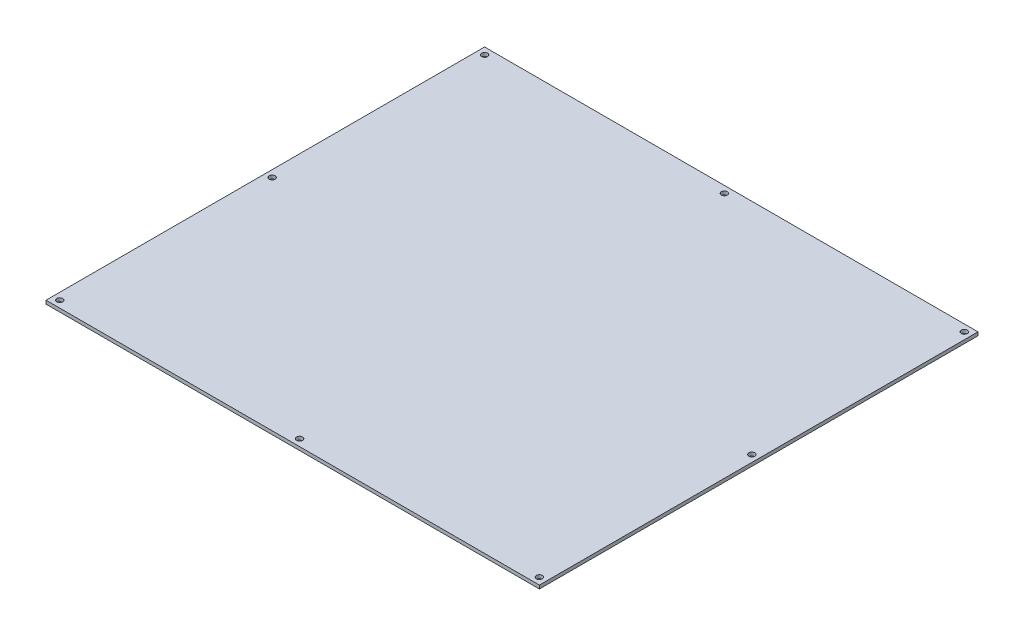
ISO-10303-21;
HEADER;
FILE_DESCRIPTION(('STEP AP214'),'2;1');
FILE_NAME('part.step','',(''),(''),'','','');
FILE_SCHEMA(('AUTOMOTIVE_DESIGN { 1 0 10303 214 1 1 1 1 }'));
ENDSEC;
DATA;
#1=APPLICATION_CONTEXT('core data for automotive mechanical design processes');
#2=APPLICATION_PROTOCOL_DEFINITION('international standard','automotive_design',2000,#1);
#3=PRODUCT_CONTEXT('',#1,'mechanical');
#4=PRODUCT('Part','Part','',(#3));
#5=PRODUCT_RELATED_PRODUCT_CATEGORY('part','',(#4));
#6=PRODUCT_DEFINITION_FORMATION('','',#4);
#7=PRODUCT_DEFINITION_CONTEXT('part definition',#1,'design');
#8=PRODUCT_DEFINITION('design','',#6,#7);
#9=PRODUCT_DEFINITION_SHAPE('','',#8);
#10=(LENGTH_UNIT() NAMED_UNIT(*) SI_UNIT(.MILLI.,.METRE.));
#11=(NAMED_UNIT(*) PLANE_ANGLE_UNIT() SI_UNIT($,.RADIAN.));
#12=(NAMED_UNIT(*) SI_UNIT($,.STERADIAN.) SOLID_ANGLE_UNIT());
#13=UNCERTAINTY_MEASURE_WITH_UNIT(LENGTH_MEASURE(1.E-05),#10,'distance_accuracy_value','');
#14=(GEOMETRIC_REPRESENTATION_CONTEXT(3) GLOBAL_UNCERTAINTY_ASSIGNED_CONTEXT((#13)) GLOBAL_UNIT_ASSIGNED_CONTEXT((#10,
#11,#12)) REPRESENTATION_CONTEXT('',''));
#15=CARTESIAN_POINT('',(0.,0.,0.));
#16=DIRECTION('',(0.,0.,1.));
#17=DIRECTION('',(1.,0.,0.));
#18=AXIS2_PLACEMENT_3D('',#15,#16,#17);
#19=CARTESIAN_POINT('',(0.,1.5875,0.));
#20=DIRECTION('',(1.,0.,0.));
#21=DIRECTION('',(0.,0.,-1.));
#22=AXIS2_PLACEMENT_3D('',#19,#20,#21);
#23=PLANE('',#22);
#24=DIRECTION('',(0.,0.,1.));
#25=VECTOR('',#24,1.);
#26=CARTESIAN_POINT('',(0.,0.,0.));
#27=LINE('',#26,#25);
#28=CARTESIAN_POINT('',(0.,0.,-203.2));
#29=VERTEX_POINT('',#28);
#30=CARTESIAN_POINT('',(0.,0.,0.));
#31=VERTEX_POINT('',#30);
#32=EDGE_CURVE('E96',#29,#31,#27,.T.);
#33=ORIENTED_EDGE('',*,*,#32,.T.);
#34=DIRECTION('',(0.,-1.,0.));
#35=VECTOR('',#34,1.);
#36=CARTESIAN_POINT('',(0.,1.5875,0.));
#37=LINE('',#36,#35);
#38=CARTESIAN_POINT('',(0.,1.5875,0.));
#39=VERTEX_POINT('',#38);
#40=EDGE_CURVE('E11',#39,#31,#37,.T.);
#41=ORIENTED_EDGE('',*,*,#40,.F.);
#42=DIRECTION('',(0.,0.,1.));
#43=VECTOR('',#42,1.);
#44=CARTESIAN_POINT('',(0.,1.5875,0.));
#45=LINE('',#44,#43);
#46=CARTESIAN_POINT('',(0.,1.5875,-203.2));
#47=VERTEX_POINT('',#46);
#48=EDGE_CURVE('E84',#47,#39,#45,.T.);
#49=ORIENTED_EDGE('',*,*,#48,.F.);
#50=DIRECTION('',(0.,-1.,0.));
#51=VECTOR('',#50,1.);
#52=CARTESIAN_POINT('',(0.,1.5875,-203.2));
#53=LINE('',#52,#51);
#54=EDGE_CURVE('E92',#47,#29,#53,.T.);
#55=ORIENTED_EDGE('',*,*,#54,.T.);
#56=EDGE_LOOP('',(#33,#41,#49,#55));
#57=FACE_BOUND('',#56,.T.);
#58=ADVANCED_FACE('F33',(#57),#23,.F.);
#59=CARTESIAN_POINT('',(0.,1.5875,0.));
#60=DIRECTION('',(0.,0.,-1.));
#61=DIRECTION('',(-1.,0.,0.));
#62=AXIS2_PLACEMENT_3D('',#59,#60,#61);
#63=PLANE('',#62);
#64=DIRECTION('',(1.,0.,0.));
#65=VECTOR('',#64,1.);
#66=CARTESIAN_POINT('',(0.,0.,0.));
#67=LINE('',#66,#65);
#68=CARTESIAN_POINT('',(228.6,0.,0.));
#69=VERTEX_POINT('',#68);
#70=EDGE_CURVE('E88',#31,#69,#67,.T.);
#71=ORIENTED_EDGE('',*,*,#70,.T.);
#72=DIRECTION('',(0.,-1.,0.));
#73=VECTOR('',#72,1.);
#74=CARTESIAN_POINT('',(228.6,1.5875,0.));
#75=LINE('',#74,#73);
#76=CARTESIAN_POINT('',(228.6,1.5875,0.));
#77=VERTEX_POINT('',#76);
#78=EDGE_CURVE('E41',#77,#69,#75,.T.);
#79=ORIENTED_EDGE('',*,*,#78,.F.);
#80=DIRECTION('',(1.,0.,0.));
#81=VECTOR('',#80,1.);
#82=CARTESIAN_POINT('',(0.,1.5875,0.));
#83=LINE('',#82,#81);
#84=EDGE_CURVE('E79',#39,#77,#83,.T.);
#85=ORIENTED_EDGE('',*,*,#84,.F.);
#86=ORIENTED_EDGE('',*,*,#40,.T.);
#87=EDGE_LOOP('',(#71,#79,#85,#86));
#88=FACE_BOUND('',#87,.T.);
#89=ADVANCED_FACE('F87',(#88),#63,.F.);
#90=CARTESIAN_POINT('',(228.6,1.5875,0.));
#91=DIRECTION('',(-1.,0.,0.));
#92=DIRECTION('',(0.,0.,1.));
#93=AXIS2_PLACEMENT_3D('',#90,#91,#92);
#94=PLANE('',#93);
#95=DIRECTION('',(0.,0.,-1.));
#96=VECTOR('',#95,1.);
#97=CARTESIAN_POINT('',(228.6,0.,0.));
#98=LINE('',#97,#96);
#99=CARTESIAN_POINT('',(228.6,0.,-203.2));
#100=VERTEX_POINT('',#99);
#101=EDGE_CURVE('E66',#69,#100,#98,.T.);
#102=ORIENTED_EDGE('',*,*,#101,.T.);
#103=DIRECTION('',(0.,-1.,0.));
#104=VECTOR('',#103,1.);
#105=CARTESIAN_POINT('',(228.6,1.5875,-203.2));
#106=LINE('',#105,#104);
#107=CARTESIAN_POINT('',(228.6,1.5875,-203.2));
#108=VERTEX_POINT('',#107);
#109=EDGE_CURVE('E89',#108,#100,#106,.T.);
#110=ORIENTED_EDGE('',*,*,#109,.F.);
#111=DIRECTION('',(0.,0.,-1.));
#112=VECTOR('',#111,1.);
#113=CARTESIAN_POINT('',(228.6,1.5875,0.));
#114=LINE('',#113,#112);
#115=EDGE_CURVE('E82',#77,#108,#114,.T.);
#116=ORIENTED_EDGE('',*,*,#115,.F.);
#117=ORIENTED_EDGE('',*,*,#78,.T.);
#118=EDGE_LOOP('',(#102,#110,#116,#117));
#119=FACE_BOUND('',#118,.T.);
#120=ADVANCED_FACE('F90',(#119),#94,.F.);
#121=CARTESIAN_POINT('',(0.,1.5875,-203.2));
#122=DIRECTION('',(0.,0.,1.));
#123=DIRECTION('',(1.,0.,0.));
#124=AXIS2_PLACEMENT_3D('',#121,#122,#123);
#125=PLANE('',#124);
#126=DIRECTION('',(-1.,0.,0.));
#127=VECTOR('',#126,1.);
#128=CARTESIAN_POINT('',(0.,0.,-203.2));
#129=LINE('',#128,#127);
#130=EDGE_CURVE('E72',#100,#29,#129,.T.);
#131=ORIENTED_EDGE('',*,*,#130,.T.);
#132=ORIENTED_EDGE('',*,*,#54,.F.);
#133=DIRECTION('',(-1.,0.,0.));
#134=VECTOR('',#133,1.);
#135=CARTESIAN_POINT('',(0.,1.5875,-203.2));
#136=LINE('',#135,#134);
#137=EDGE_CURVE('E49',#108,#47,#136,.T.);
#138=ORIENTED_EDGE('',*,*,#137,.F.);
#139=ORIENTED_EDGE('',*,*,#109,.T.);
#140=EDGE_LOOP('',(#131,#132,#138,#139));
#141=FACE_BOUND('',#140,.T.);
#142=ADVANCED_FACE('F104',(#141),#125,.F.);
#143=CARTESIAN_POINT('',(0.,1.5875,0.));
#144=DIRECTION('',(0.,-1.,0.));
#145=DIRECTION('',(0.,0.,-1.));
#146=AXIS2_PLACEMENT_3D('',#143,#144,#145);
#147=PLANE('',#146);
#148=CARTESIAN_POINT('',(225.425,1.5875,-101.6));
#149=DIRECTION('',(0.,1.,0.));
#150=DIRECTION('',(0.,0.,1.));
#151=AXIS2_PLACEMENT_3D('',#148,#149,#150);
#152=CIRCLE('',#151,1.39700000000002);
#153=CARTESIAN_POINT('',(225.425,1.5875,-100.203));
#154=VERTEX_POINT('',#153);
#155=EDGE_CURVE('E152',#154,#154,#152,.T.);
#156=ORIENTED_EDGE('',*,*,#155,.F.);
#157=EDGE_LOOP('',(#156));
#158=FACE_BOUND('',#157,.T.);
#159=CARTESIAN_POINT('',(3.17500000000001,1.5875,-101.6));
#160=DIRECTION('',(0.,1.,0.));
#161=DIRECTION('',(0.,0.,1.));
#162=AXIS2_PLACEMENT_3D('',#159,#160,#161);
#163=CIRCLE('',#162,1.397);
#164=CARTESIAN_POINT('',(3.17500000000001,1.5875,-100.203));
#165=VERTEX_POINT('',#164);
#166=EDGE_CURVE('E146',#165,#165,#163,.T.);
#167=ORIENTED_EDGE('',*,*,#166,.F.);
#168=EDGE_LOOP('',(#167));
#169=FACE_BOUND('',#168,.T.);
#170=CARTESIAN_POINT('',(225.425,1.5875,-3.175));
#171=DIRECTION('',(0.,1.,0.));
#172=DIRECTION('',(0.,0.,1.));
#173=AXIS2_PLACEMENT_3D('',#170,#171,#172);
#174=CIRCLE('',#173,1.39700000000002);
#175=CARTESIAN_POINT('',(225.425,1.5875,-1.77799999999998));
#176=VERTEX_POINT('',#175);
#177=EDGE_CURVE('E140',#176,#176,#174,.T.);
#178=ORIENTED_EDGE('',*,*,#177,.F.);
#179=EDGE_LOOP('',(#178));
#180=FACE_BOUND('',#179,.T.);
#181=CARTESIAN_POINT('',(114.3,1.5875,-3.175));
#182=DIRECTION('',(0.,1.,0.));
#183=DIRECTION('',(0.,0.,1.));
#184=AXIS2_PLACEMENT_3D('',#181,#182,#183);
#185=CIRCLE('',#184,1.39699999999999);
#186=CARTESIAN_POINT('',(114.3,1.5875,-1.77800000000001));
#187=VERTEX_POINT('',#186);
#188=EDGE_CURVE('E134',#187,#187,#185,.T.);
#189=ORIENTED_EDGE('',*,*,#188,.F.);
#190=EDGE_LOOP('',(#189));
#191=FACE_BOUND('',#190,.T.);
#192=CARTESIAN_POINT('',(3.17500000000002,1.5875,-3.175));
#193=DIRECTION('',(0.,1.,0.));
#194=DIRECTION('',(0.,0.,1.));
#195=AXIS2_PLACEMENT_3D('',#192,#193,#194);
#196=CIRCLE('',#195,1.397);
#197=CARTESIAN_POINT('',(3.17500000000002,1.5875,-1.778));
#198=VERTEX_POINT('',#197);
#199=EDGE_CURVE('E128',#198,#198,#196,.T.);
#200=ORIENTED_EDGE('',*,*,#199,.F.);
#201=EDGE_LOOP('',(#200));
#202=FACE_BOUND('',#201,.T.);
#203=CARTESIAN_POINT('',(225.425,1.5875,-200.025));
#204=DIRECTION('',(0.,1.,0.));
#205=DIRECTION('',(0.,0.,1.));
#206=AXIS2_PLACEMENT_3D('',#203,#204,#205);
#207=CIRCLE('',#206,1.39700000000002);
#208=CARTESIAN_POINT('',(225.425,1.5875,-198.628));
#209=VERTEX_POINT('',#208);
#210=EDGE_CURVE('E122',#209,#209,#207,.T.);
#211=ORIENTED_EDGE('',*,*,#210,.F.);
#212=EDGE_LOOP('',(#211));
#213=FACE_BOUND('',#212,.T.);
#214=CARTESIAN_POINT('',(114.3,1.5875,-200.025));
#215=DIRECTION('',(0.,1.,0.));
#216=DIRECTION('',(0.,0.,1.));
#217=AXIS2_PLACEMENT_3D('',#214,#215,#216);
#218=CIRCLE('',#217,1.39699999999999);
#219=CARTESIAN_POINT('',(114.3,1.5875,-198.628));
#220=VERTEX_POINT('',#219);
#221=EDGE_CURVE('E116',#220,#220,#218,.T.);
#222=ORIENTED_EDGE('',*,*,#221,.F.);
#223=EDGE_LOOP('',(#222));
#224=FACE_BOUND('',#223,.T.);
#225=CARTESIAN_POINT('',(3.175,1.5875,-200.025));
#226=DIRECTION('',(0.,1.,0.));
#227=DIRECTION('',(0.,0.,1.));
#228=AXIS2_PLACEMENT_3D('',#225,#226,#227);
#229=CIRCLE('',#228,1.397);
#230=CARTESIAN_POINT('',(3.175,1.5875,-198.628));
#231=VERTEX_POINT('',#230);
#232=EDGE_CURVE('E110',#231,#231,#229,.T.);
#233=ORIENTED_EDGE('',*,*,#232,.F.);
#234=EDGE_LOOP('',(#233));
#235=FACE_BOUND('',#234,.T.);
#236=ORIENTED_EDGE('',*,*,#48,.T.);
#237=ORIENTED_EDGE('',*,*,#84,.T.);
#238=ORIENTED_EDGE('',*,*,#115,.T.);
#239=ORIENTED_EDGE('',*,*,#137,.T.);
#240=EDGE_LOOP('',(#236,#237,#238,#239));
#241=FACE_BOUND('',#240,.T.);
#242=ADVANCED_FACE('F80',(#158,#169,#180,#191,#202,#213,#224,#235,#241),#147,.F.);
#243=CARTESIAN_POINT('',(0.,0.,0.));
#244=DIRECTION('',(0.,-1.,0.));
#245=DIRECTION('',(0.,0.,-1.));
#246=AXIS2_PLACEMENT_3D('',#243,#244,#245);
#247=PLANE('',#246);
#248=CARTESIAN_POINT('',(225.425,0.,-101.6));
#249=DIRECTION('',(0.,1.,0.));
#250=DIRECTION('',(0.,0.,1.));
#251=AXIS2_PLACEMENT_3D('',#248,#249,#250);
#252=CIRCLE('',#251,1.39700000000002);
#253=CARTESIAN_POINT('',(225.425,0.,-100.203));
#254=VERTEX_POINT('',#253);
#255=EDGE_CURVE('E149',#254,#254,#252,.T.);
#256=ORIENTED_EDGE('',*,*,#255,.T.);
#257=EDGE_LOOP('',(#256));
#258=FACE_BOUND('',#257,.T.);
#259=CARTESIAN_POINT('',(3.17500000000001,0.,-101.6));
#260=DIRECTION('',(0.,1.,0.));
#261=DIRECTION('',(0.,0.,1.));
#262=AXIS2_PLACEMENT_3D('',#259,#260,#261);
#263=CIRCLE('',#262,1.397);
#264=CARTESIAN_POINT('',(3.17500000000001,0.,-100.203));
#265=VERTEX_POINT('',#264);
#266=EDGE_CURVE('E143',#265,#265,#263,.T.);
#267=ORIENTED_EDGE('',*,*,#266,.T.);
#268=EDGE_LOOP('',(#267));
#269=FACE_BOUND('',#268,.T.);
#270=CARTESIAN_POINT('',(225.425,0.,-3.175));
#271=DIRECTION('',(0.,1.,0.));
#272=DIRECTION('',(0.,0.,1.));
#273=AXIS2_PLACEMENT_3D('',#270,#271,#272);
#274=CIRCLE('',#273,1.39700000000002);
#275=CARTESIAN_POINT('',(225.425,0.,-1.77799999999998));
#276=VERTEX_POINT('',#275);
#277=EDGE_CURVE('E137',#276,#276,#274,.T.);
#278=ORIENTED_EDGE('',*,*,#277,.T.);
#279=EDGE_LOOP('',(#278));
#280=FACE_BOUND('',#279,.T.);
#281=CARTESIAN_POINT('',(114.3,0.,-3.175));
#282=DIRECTION('',(0.,1.,0.));
#283=DIRECTION('',(0.,0.,1.));
#284=AXIS2_PLACEMENT_3D('',#281,#282,#283);
#285=CIRCLE('',#284,1.39699999999999);
#286=CARTESIAN_POINT('',(114.3,0.,-1.77800000000001));
#287=VERTEX_POINT('',#286);
#288=EDGE_CURVE('E131',#287,#287,#285,.T.);
#289=ORIENTED_EDGE('',*,*,#288,.T.);
#290=EDGE_LOOP('',(#289));
#291=FACE_BOUND('',#290,.T.);
#292=CARTESIAN_POINT('',(3.17500000000002,0.,-3.175));
#293=DIRECTION('',(0.,1.,0.));
#294=DIRECTION('',(0.,0.,1.));
#295=AXIS2_PLACEMENT_3D('',#292,#293,#294);
#296=CIRCLE('',#295,1.397);
#297=CARTESIAN_POINT('',(3.17500000000002,0.,-1.778));
#298=VERTEX_POINT('',#297);
#299=EDGE_CURVE('E125',#298,#298,#296,.T.);
#300=ORIENTED_EDGE('',*,*,#299,.T.);
#301=EDGE_LOOP('',(#300));
#302=FACE_BOUND('',#301,.T.);
#303=CARTESIAN_POINT('',(225.425,0.,-200.025));
#304=DIRECTION('',(0.,1.,0.));
#305=DIRECTION('',(0.,0.,1.));
#306=AXIS2_PLACEMENT_3D('',#303,#304,#305);
#307=CIRCLE('',#306,1.39700000000002);
#308=CARTESIAN_POINT('',(225.425,0.,-198.628));
#309=VERTEX_POINT('',#308);
#310=EDGE_CURVE('E119',#309,#309,#307,.T.);
#311=ORIENTED_EDGE('',*,*,#310,.T.);
#312=EDGE_LOOP('',(#311));
#313=FACE_BOUND('',#312,.T.);
#314=CARTESIAN_POINT('',(114.3,0.,-200.025));
#315=DIRECTION('',(0.,1.,0.));
#316=DIRECTION('',(0.,0.,1.));
#317=AXIS2_PLACEMENT_3D('',#314,#315,#316);
#318=CIRCLE('',#317,1.39699999999999);
#319=CARTESIAN_POINT('',(114.3,0.,-198.628));
#320=VERTEX_POINT('',#319);
#321=EDGE_CURVE('E113',#320,#320,#318,.T.);
#322=ORIENTED_EDGE('',*,*,#321,.T.);
#323=EDGE_LOOP('',(#322));
#324=FACE_BOUND('',#323,.T.);
#325=CARTESIAN_POINT('',(3.175,0.,-200.025));
#326=DIRECTION('',(0.,1.,0.));
#327=DIRECTION('',(0.,0.,1.));
#328=AXIS2_PLACEMENT_3D('',#325,#326,#327);
#329=CIRCLE('',#328,1.397);
#330=CARTESIAN_POINT('',(3.175,0.,-198.628));
#331=VERTEX_POINT('',#330);
#332=EDGE_CURVE('E99',#331,#331,#329,.T.);
#333=ORIENTED_EDGE('',*,*,#332,.T.);
#334=EDGE_LOOP('',(#333));
#335=FACE_BOUND('',#334,.T.);
#336=ORIENTED_EDGE('',*,*,#32,.F.);
#337=ORIENTED_EDGE('',*,*,#130,.F.);
#338=ORIENTED_EDGE('',*,*,#101,.F.);
#339=ORIENTED_EDGE('',*,*,#70,.F.);
#340=EDGE_LOOP('',(#336,#337,#338,#339));
#341=FACE_BOUND('',#340,.T.);
#342=ADVANCED_FACE('F107',(#258,#269,#280,#291,#302,#313,#324,#335,#341),#247,.T.);
#343=CARTESIAN_POINT('',(3.175,0.,-200.025));
#344=DIRECTION('',(0.,1.,0.));
#345=DIRECTION('',(0.,0.,1.));
#346=AXIS2_PLACEMENT_3D('',#343,#344,#345);
#347=CYLINDRICAL_SURFACE('',#346,1.397);
#348=ORIENTED_EDGE('',*,*,#332,.F.);
#349=EDGE_LOOP('',(#348));
#350=FACE_BOUND('',#349,.T.);
#351=ORIENTED_EDGE('',*,*,#232,.T.);
#352=EDGE_LOOP('',(#351));
#353=FACE_BOUND('',#352,.T.);
#354=ADVANCED_FACE('F184',(#350,#353),#347,.F.);
#355=CARTESIAN_POINT('',(114.3,0.,-200.025));
#356=DIRECTION('',(0.,1.,0.));
#357=DIRECTION('',(0.,0.,1.));
#358=AXIS2_PLACEMENT_3D('',#355,#356,#357);
#359=CYLINDRICAL_SURFACE('',#358,1.39699999999999);
#360=ORIENTED_EDGE('',*,*,#321,.F.);
#361=EDGE_LOOP('',(#360));
#362=FACE_BOUND('',#361,.T.);
#363=ORIENTED_EDGE('',*,*,#221,.T.);
#364=EDGE_LOOP('',(#363));
#365=FACE_BOUND('',#364,.T.);
#366=ADVANCED_FACE('F186',(#362,#365),#359,.F.);
#367=CARTESIAN_POINT('',(225.425,0.,-200.025));
#368=DIRECTION('',(0.,1.,0.));
#369=DIRECTION('',(0.,0.,1.));
#370=AXIS2_PLACEMENT_3D('',#367,#368,#369);
#371=CYLINDRICAL_SURFACE('',#370,1.39700000000002);
#372=ORIENTED_EDGE('',*,*,#310,.F.);
#373=EDGE_LOOP('',(#372));
#374=FACE_BOUND('',#373,.T.);
#375=ORIENTED_EDGE('',*,*,#210,.T.);
#376=EDGE_LOOP('',(#375));
#377=FACE_BOUND('',#376,.T.);
#378=ADVANCED_FACE('F193',(#374,#377),#371,.F.);
#379=CARTESIAN_POINT('',(3.17500000000002,0.,-3.175));
#380=DIRECTION('',(0.,1.,0.));
#381=DIRECTION('',(0.,0.,1.));
#382=AXIS2_PLACEMENT_3D('',#379,#380,#381);
#383=CYLINDRICAL_SURFACE('',#382,1.397);
#384=ORIENTED_EDGE('',*,*,#299,.F.);
#385=EDGE_LOOP('',(#384));
#386=FACE_BOUND('',#385,.T.);
#387=ORIENTED_EDGE('',*,*,#199,.T.);
#388=EDGE_LOOP('',(#387));
#389=FACE_BOUND('',#388,.T.);
#390=ADVANCED_FACE('F239',(#386,#389),#383,.F.);
#391=CARTESIAN_POINT('',(114.3,0.,-3.175));
#392=DIRECTION('',(0.,1.,0.));
#393=DIRECTION('',(0.,0.,1.));
#394=AXIS2_PLACEMENT_3D('',#391,#392,#393);
#395=CYLINDRICAL_SURFACE('',#394,1.39699999999999);
#396=ORIENTED_EDGE('',*,*,#288,.F.);
#397=EDGE_LOOP('',(#396));
#398=FACE_BOUND('',#397,.T.);
#399=ORIENTED_EDGE('',*,*,#188,.T.);
#400=EDGE_LOOP('',(#399));
#401=FACE_BOUND('',#400,.T.);
#402=ADVANCED_FACE('F249',(#398,#401),#395,.F.);
#403=CARTESIAN_POINT('',(225.425,0.,-3.175));
#404=DIRECTION('',(0.,1.,0.));
#405=DIRECTION('',(0.,0.,1.));
#406=AXIS2_PLACEMENT_3D('',#403,#404,#405);
#407=CYLINDRICAL_SURFACE('',#406,1.39700000000002);
#408=ORIENTED_EDGE('',*,*,#277,.F.);
#409=EDGE_LOOP('',(#408));
#410=FACE_BOUND('',#409,.T.);
#411=ORIENTED_EDGE('',*,*,#177,.T.);
#412=EDGE_LOOP('',(#411));
#413=FACE_BOUND('',#412,.T.);
#414=ADVANCED_FACE('F259',(#410,#413),#407,.F.);
#415=CARTESIAN_POINT('',(3.17500000000001,0.,-101.6));
#416=DIRECTION('',(0.,1.,0.));
#417=DIRECTION('',(0.,0.,1.));
#418=AXIS2_PLACEMENT_3D('',#415,#416,#417);
#419=CYLINDRICAL_SURFACE('',#418,1.397);
#420=ORIENTED_EDGE('',*,*,#266,.F.);
#421=EDGE_LOOP('',(#420));
#422=FACE_BOUND('',#421,.T.);
#423=ORIENTED_EDGE('',*,*,#166,.T.);
#424=EDGE_LOOP('',(#423));
#425=FACE_BOUND('',#424,.T.);
#426=ADVANCED_FACE('F163',(#422,#425),#419,.F.);
#427=CARTESIAN_POINT('',(225.425,0.,-101.6));
#428=DIRECTION('',(0.,1.,0.));
#429=DIRECTION('',(0.,0.,1.));
#430=AXIS2_PLACEMENT_3D('',#427,#428,#429);
#431=CYLINDRICAL_SURFACE('',#430,1.39700000000002);
#432=ORIENTED_EDGE('',*,*,#255,.F.);
#433=EDGE_LOOP('',(#432));
#434=FACE_BOUND('',#433,.T.);
#435=ORIENTED_EDGE('',*,*,#155,.T.);
#436=EDGE_LOOP('',(#435));
#437=FACE_BOUND('',#436,.T.);
#438=ADVANCED_FACE('F160',(#434,#437),#431,.F.);
#439=CLOSED_SHELL('',(#58,#89,#120,#142,#242,#342,#354,#366,#378,#390,#402,#414,#426,#438));
#440=MANIFOLD_SOLID_BREP('B2',#439);
#441=ADVANCED_BREP_SHAPE_REPRESENTATION('',(#18,#440),#14);
#442=SHAPE_DEFINITION_REPRESENTATION(#9,#441);
ENDSEC;
END-ISO-10303-21;
